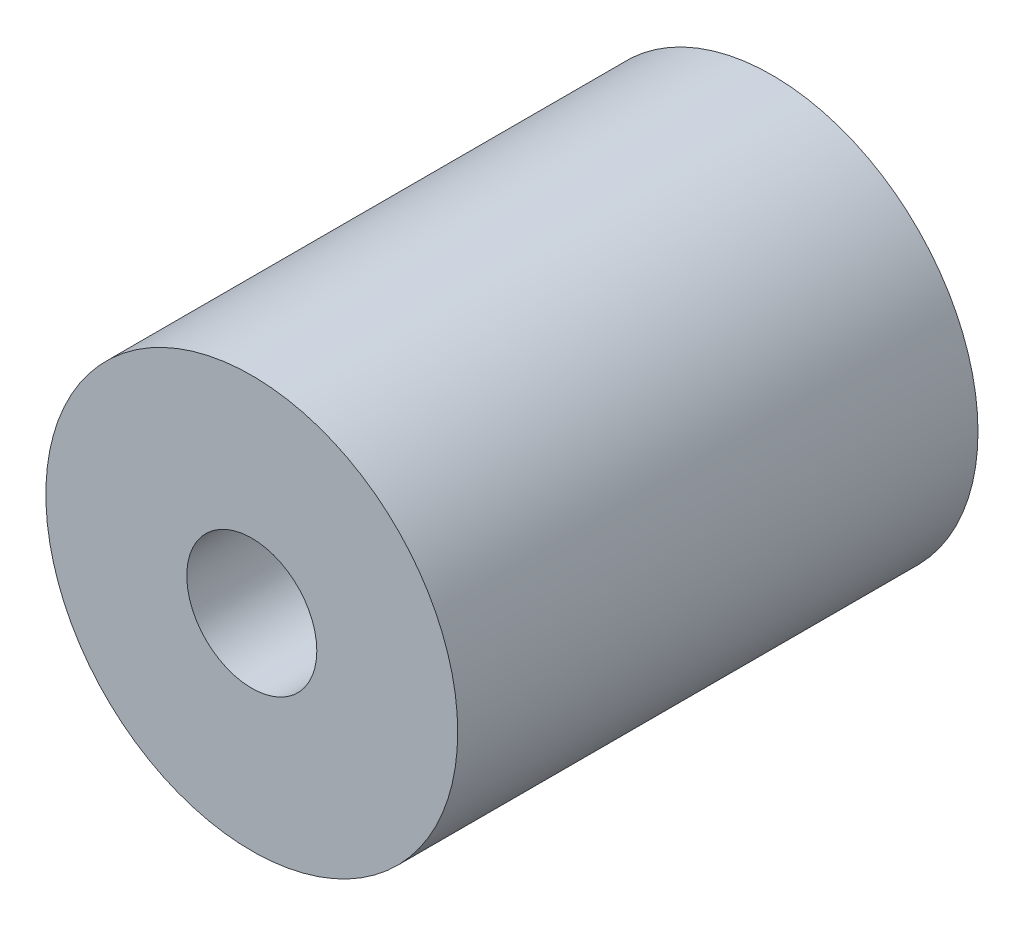
ISO-10303-21;
HEADER;
FILE_DESCRIPTION(('STEP AP214'),'2;1');
FILE_NAME('part.step','',(''),(''),'','','');
FILE_SCHEMA(('AUTOMOTIVE_DESIGN { 1 0 10303 214 1 1 1 1 }'));
ENDSEC;
DATA;
#1=APPLICATION_CONTEXT('core data for automotive mechanical design processes');
#2=APPLICATION_PROTOCOL_DEFINITION('international standard','automotive_design',2000,#1);
#3=PRODUCT_CONTEXT('',#1,'mechanical');
#4=PRODUCT('Part','Part','',(#3));
#5=PRODUCT_RELATED_PRODUCT_CATEGORY('part','',(#4));
#6=PRODUCT_DEFINITION_FORMATION('','',#4);
#7=PRODUCT_DEFINITION_CONTEXT('part definition',#1,'design');
#8=PRODUCT_DEFINITION('design','',#6,#7);
#9=PRODUCT_DEFINITION_SHAPE('','',#8);
#10=(LENGTH_UNIT() NAMED_UNIT(*) SI_UNIT(.MILLI.,.METRE.));
#11=(NAMED_UNIT(*) PLANE_ANGLE_UNIT() SI_UNIT($,.RADIAN.));
#12=(NAMED_UNIT(*) SI_UNIT($,.STERADIAN.) SOLID_ANGLE_UNIT());
#13=UNCERTAINTY_MEASURE_WITH_UNIT(LENGTH_MEASURE(1.E-05),#10,'distance_accuracy_value','');
#14=(GEOMETRIC_REPRESENTATION_CONTEXT(3) GLOBAL_UNCERTAINTY_ASSIGNED_CONTEXT((#13)) GLOBAL_UNIT_ASSIGNED_CONTEXT((#10,
#11,#12)) REPRESENTATION_CONTEXT('',''));
#15=CARTESIAN_POINT('',(0.,0.,0.));
#16=DIRECTION('',(0.,0.,1.));
#17=DIRECTION('',(1.,0.,0.));
#18=AXIS2_PLACEMENT_3D('',#15,#16,#17);
#19=CARTESIAN_POINT('',(0.,0.,24.));
#20=DIRECTION('',(0.,0.,1.));
#21=DIRECTION('',(1.,0.,0.));
#22=AXIS2_PLACEMENT_3D('',#19,#20,#21);
#23=PLANE('',#22);
#24=CARTESIAN_POINT('',(0.,0.,24.));
#25=DIRECTION('',(0.,0.,1.));
#26=DIRECTION('',(1.,0.,0.));
#27=AXIS2_PLACEMENT_3D('',#24,#25,#26);
#28=CIRCLE('',#27,9.5);
#29=CARTESIAN_POINT('',(9.5,0.,24.));
#30=VERTEX_POINT('',#29);
#31=EDGE_CURVE('E10',#30,#30,#28,.T.);
#32=ORIENTED_EDGE('',*,*,#31,.T.);
#33=EDGE_LOOP('',(#32));
#34=FACE_BOUND('',#33,.T.);
#35=CARTESIAN_POINT('',(0.,0.,24.));
#36=DIRECTION('',(0.,0.,1.));
#37=DIRECTION('',(1.,0.,0.));
#38=AXIS2_PLACEMENT_3D('',#35,#36,#37);
#39=CIRCLE('',#38,3.);
#40=CARTESIAN_POINT('',(3.,0.,24.));
#41=VERTEX_POINT('',#40);
#42=EDGE_CURVE('E50',#41,#41,#39,.T.);
#43=ORIENTED_EDGE('',*,*,#42,.F.);
#44=EDGE_LOOP('',(#43));
#45=FACE_BOUND('',#44,.T.);
#46=ADVANCED_FACE('F37',(#34,#45),#23,.T.);
#47=CARTESIAN_POINT('',(0.,0.,0.));
#48=DIRECTION('',(0.,0.,1.));
#49=DIRECTION('',(1.,0.,0.));
#50=AXIS2_PLACEMENT_3D('',#47,#48,#49);
#51=PLANE('',#50);
#52=CARTESIAN_POINT('',(0.,0.,0.));
#53=DIRECTION('',(0.,0.,1.));
#54=DIRECTION('',(1.,0.,0.));
#55=AXIS2_PLACEMENT_3D('',#52,#53,#54);
#56=CIRCLE('',#55,9.5);
#57=CARTESIAN_POINT('',(9.5,0.,0.));
#58=VERTEX_POINT('',#57);
#59=EDGE_CURVE('E41',#58,#58,#56,.T.);
#60=ORIENTED_EDGE('',*,*,#59,.F.);
#61=EDGE_LOOP('',(#60));
#62=FACE_BOUND('',#61,.T.);
#63=CARTESIAN_POINT('',(0.,0.,0.));
#64=DIRECTION('',(0.,0.,1.));
#65=DIRECTION('',(1.,0.,0.));
#66=AXIS2_PLACEMENT_3D('',#63,#64,#65);
#67=CIRCLE('',#66,3.);
#68=CARTESIAN_POINT('',(3.,0.,0.));
#69=VERTEX_POINT('',#68);
#70=EDGE_CURVE('E52',#69,#69,#67,.T.);
#71=ORIENTED_EDGE('',*,*,#70,.T.);
#72=EDGE_LOOP('',(#71));
#73=FACE_BOUND('',#72,.T.);
#74=ADVANCED_FACE('F64',(#62,#73),#51,.F.);
#75=CARTESIAN_POINT('',(0.,0.,24.));
#76=DIRECTION('',(0.,0.,-1.));
#77=DIRECTION('',(-1.,0.,0.));
#78=AXIS2_PLACEMENT_3D('',#75,#76,#77);
#79=CYLINDRICAL_SURFACE('',#78,9.5);
#80=ORIENTED_EDGE('',*,*,#31,.F.);
#81=EDGE_LOOP('',(#80));
#82=FACE_BOUND('',#81,.T.);
#83=ORIENTED_EDGE('',*,*,#59,.T.);
#84=EDGE_LOOP('',(#83));
#85=FACE_BOUND('',#84,.T.);
#86=ADVANCED_FACE('F39',(#82,#85),#79,.T.);
#87=CARTESIAN_POINT('',(0.,0.,24.));
#88=DIRECTION('',(0.,0.,-1.));
#89=DIRECTION('',(-1.,0.,0.));
#90=AXIS2_PLACEMENT_3D('',#87,#88,#89);
#91=CYLINDRICAL_SURFACE('',#90,3.);
#92=ORIENTED_EDGE('',*,*,#42,.T.);
#93=EDGE_LOOP('',(#92));
#94=FACE_BOUND('',#93,.T.);
#95=ORIENTED_EDGE('',*,*,#70,.F.);
#96=EDGE_LOOP('',(#95));
#97=FACE_BOUND('',#96,.T.);
#98=ADVANCED_FACE('F60',(#94,#97),#91,.F.);
#99=CLOSED_SHELL('',(#46,#74,#86,#98));
#100=MANIFOLD_SOLID_BREP('B2',#99);
#101=ADVANCED_BREP_SHAPE_REPRESENTATION('',(#18,#100),#14);
#102=SHAPE_DEFINITION_REPRESENTATION(#9,#101);
ENDSEC;
END-ISO-10303-21;
